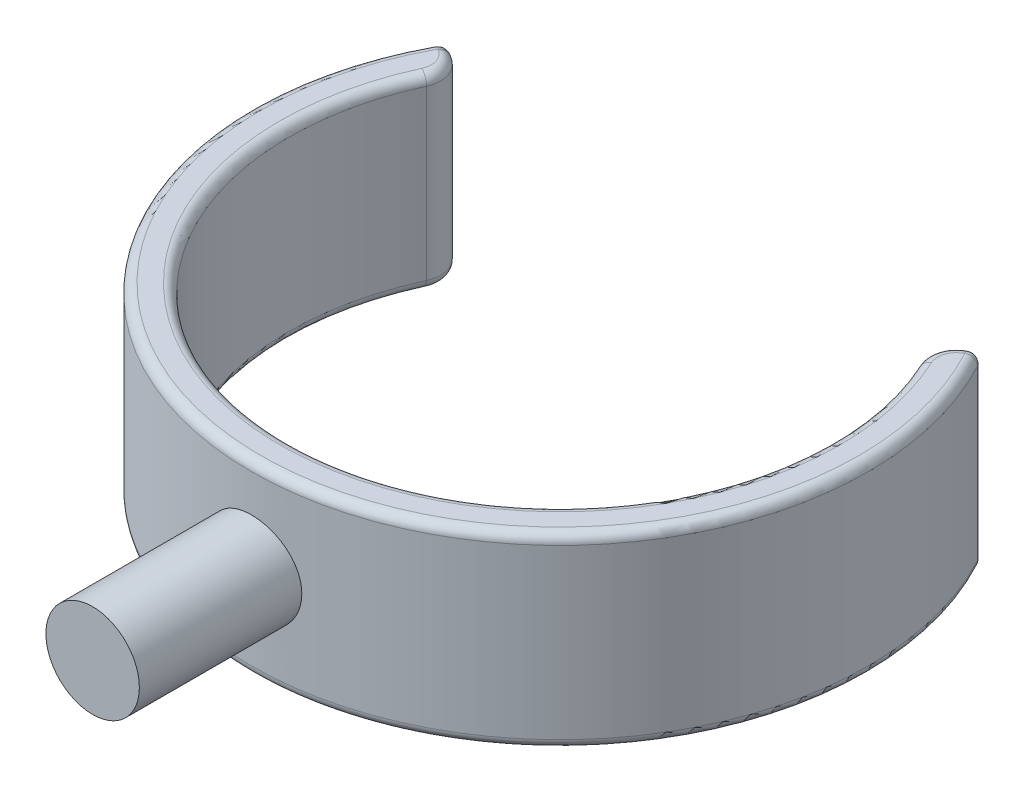
ISO-10303-21;
HEADER;
FILE_DESCRIPTION(('STEP AP214'),'2;1');
FILE_NAME('part.step','',(''),(''),'','','');
FILE_SCHEMA(('AUTOMOTIVE_DESIGN { 1 0 10303 214 1 1 1 1 }'));
ENDSEC;
DATA;
#1=APPLICATION_CONTEXT('core data for automotive mechanical design processes');
#2=APPLICATION_PROTOCOL_DEFINITION('international standard','automotive_design',2000,#1);
#3=PRODUCT_CONTEXT('',#1,'mechanical');
#4=PRODUCT('Part','Part','',(#3));
#5=PRODUCT_RELATED_PRODUCT_CATEGORY('part','',(#4));
#6=PRODUCT_DEFINITION_FORMATION('','',#4);
#7=PRODUCT_DEFINITION_CONTEXT('part definition',#1,'design');
#8=PRODUCT_DEFINITION('design','',#6,#7);
#9=PRODUCT_DEFINITION_SHAPE('','',#8);
#10=(LENGTH_UNIT() NAMED_UNIT(*) SI_UNIT(.MILLI.,.METRE.));
#11=(NAMED_UNIT(*) PLANE_ANGLE_UNIT() SI_UNIT($,.RADIAN.));
#12=(NAMED_UNIT(*) SI_UNIT($,.STERADIAN.) SOLID_ANGLE_UNIT());
#13=UNCERTAINTY_MEASURE_WITH_UNIT(LENGTH_MEASURE(1.E-05),#10,'distance_accuracy_value','');
#14=(GEOMETRIC_REPRESENTATION_CONTEXT(3) GLOBAL_UNCERTAINTY_ASSIGNED_CONTEXT((#13)) GLOBAL_UNIT_ASSIGNED_CONTEXT((#10,
#11,#12)) REPRESENTATION_CONTEXT('',''));
#15=CARTESIAN_POINT('',(0.,0.,0.));
#16=DIRECTION('',(0.,0.,1.));
#17=DIRECTION('',(1.,0.,0.));
#18=AXIS2_PLACEMENT_3D('',#15,#16,#17);
#19=CARTESIAN_POINT('',(0.,20.,0.));
#20=DIRECTION('',(0.,-1.,0.));
#21=DIRECTION('',(0.,0.,-1.));
#22=AXIS2_PLACEMENT_3D('',#19,#20,#21);
#23=CYLINDRICAL_SURFACE('',#22,29.);
#24=DIRECTION('',(0.,-1.,0.));
#25=VECTOR('',#24,1.);
#26=CARTESIAN_POINT('',(26.3635006361451,20.,-12.0816321003406));
#27=LINE('',#26,#25);
#28=CARTESIAN_POINT('',(26.3635006361451,19.,-12.0816321003406));
#29=VERTEX_POINT('',#28);
#30=CARTESIAN_POINT('',(26.3635006361451,1.,-12.0816321003406));
#31=VERTEX_POINT('',#30);
#32=EDGE_CURVE('E396',#29,#31,#27,.T.);
#33=ORIENTED_EDGE('',*,*,#32,.T.);
#34=CARTESIAN_POINT('',(0.,1.,0.));
#35=DIRECTION('',(0.,1.,0.));
#36=DIRECTION('',(0.,0.,1.));
#37=AXIS2_PLACEMENT_3D('',#34,#35,#36);
#38=CIRCLE('',#37,29.);
#39=CARTESIAN_POINT('',(-26.3635006361451,1.,-12.0816321003406));
#40=VERTEX_POINT('',#39);
#41=EDGE_CURVE('E210',#31,#40,#38,.F.);
#42=ORIENTED_EDGE('',*,*,#41,.T.);
#43=DIRECTION('',(0.,-1.,0.));
#44=VECTOR('',#43,1.);
#45=CARTESIAN_POINT('',(-26.3635006361451,20.,-12.0816321003406));
#46=LINE('',#45,#44);
#47=CARTESIAN_POINT('',(-26.3635006361451,19.,-12.0816321003406));
#48=VERTEX_POINT('',#47);
#49=EDGE_CURVE('E178',#40,#48,#46,.F.);
#50=ORIENTED_EDGE('',*,*,#49,.T.);
#51=CARTESIAN_POINT('',(0.,19.,0.));
#52=DIRECTION('',(0.,1.,0.));
#53=DIRECTION('',(0.,0.,1.));
#54=AXIS2_PLACEMENT_3D('',#51,#52,#53);
#55=CIRCLE('',#54,29.);
#56=EDGE_CURVE('E208',#48,#29,#55,.T.);
#57=ORIENTED_EDGE('',*,*,#56,.T.);
#58=EDGE_LOOP('',(#33,#42,#50,#57));
#59=FACE_BOUND('',#58,.T.);
#60=ADVANCED_FACE('F39',(#59),#23,.F.);
#61=CARTESIAN_POINT('',(-44.6611665210767,20.,-25.7851365132662));
#62=DIRECTION('',(-0.499999999999998,0.,0.86602540378444));
#63=DIRECTION('',(0.86602540378444,0.,0.499999999999998));
#64=AXIS2_PLACEMENT_3D('',#61,#62,#63);
#65=PLANE('',#64);
#66=DIRECTION('',(0.,1.,0.));
#67=VECTOR('',#66,1.);
#68=CARTESIAN_POINT('',(-27.5907593226428,0.,-15.9295323220739));
#69=LINE('',#68,#67);
#70=CARTESIAN_POINT('',(-27.5907593226428,19.,-15.9295323220739));
#71=VERTEX_POINT('',#70);
#72=CARTESIAN_POINT('',(-27.5907593226428,1.,-15.9295323220739));
#73=VERTEX_POINT('',#72);
#74=EDGE_CURVE('E283',#71,#73,#69,.F.);
#75=ORIENTED_EDGE('',*,*,#74,.T.);
#76=DIRECTION('',(-0.86602540378444,0.,-0.499999999999998));
#77=VECTOR('',#76,1.);
#78=CARTESIAN_POINT('',(-44.6611665210767,1.,-25.7851365132662));
#79=LINE('',#78,#77);
#80=CARTESIAN_POINT('',(-27.6992779689291,1.,-15.9921855917194));
#81=VERTEX_POINT('',#80);
#82=EDGE_CURVE('E220',#73,#81,#79,.T.);
#83=ORIENTED_EDGE('',*,*,#82,.T.);
#84=DIRECTION('',(0.,-1.,0.));
#85=VECTOR('',#84,1.);
#86=CARTESIAN_POINT('',(-27.6992779689291,20.,-15.9921855917194));
#87=LINE('',#86,#85);
#88=CARTESIAN_POINT('',(-27.6992779689291,19.,-15.9921855917194));
#89=VERTEX_POINT('',#88);
#90=EDGE_CURVE('E216',#81,#89,#87,.F.);
#91=ORIENTED_EDGE('',*,*,#90,.T.);
#92=DIRECTION('',(-0.86602540378444,0.,-0.499999999999998));
#93=VECTOR('',#92,1.);
#94=CARTESIAN_POINT('',(-27.5907593226428,19.,-15.9295323220739));
#95=LINE('',#94,#93);
#96=EDGE_CURVE('E218',#89,#71,#95,.F.);
#97=ORIENTED_EDGE('',*,*,#96,.T.);
#98=EDGE_LOOP('',(#75,#83,#91,#97));
#99=FACE_BOUND('',#98,.T.);
#100=ADVANCED_FACE('F309',(#99),#65,.F.);
#101=CARTESIAN_POINT('',(0.,20.,0.));
#102=DIRECTION('',(0.,-1.,0.));
#103=DIRECTION('',(0.,0.,-1.));
#104=AXIS2_PLACEMENT_3D('',#101,#102,#103);
#105=CYLINDRICAL_SURFACE('',#104,33.);
#106=CARTESIAN_POINT('',(0.,1.,0.));
#107=DIRECTION('',(0.,1.,0.));
#108=DIRECTION('',(0.,0.,1.));
#109=AXIS2_PLACEMENT_3D('',#106,#107,#108);
#110=CIRCLE('',#109,33.);
#111=CARTESIAN_POINT('',(-29.0805054054582,1.,-15.5988526938079));
#112=VERTEX_POINT('',#111);
#113=CARTESIAN_POINT('',(29.0805054054581,1.,-15.5988526938079));
#114=VERTEX_POINT('',#113);
#115=EDGE_CURVE('E151',#112,#114,#110,.T.);
#116=ORIENTED_EDGE('',*,*,#115,.T.);
#117=DIRECTION('',(0.,-1.,0.));
#118=VECTOR('',#117,1.);
#119=CARTESIAN_POINT('',(29.0805054054582,20.,-15.5988526938079));
#120=LINE('',#119,#118);
#121=CARTESIAN_POINT('',(29.0805054054581,19.,-15.5988526938079));
#122=VERTEX_POINT('',#121);
#123=EDGE_CURVE('E147',#114,#122,#120,.F.);
#124=ORIENTED_EDGE('',*,*,#123,.T.);
#125=CARTESIAN_POINT('',(0.,19.,0.));
#126=DIRECTION('',(0.,1.,0.));
#127=DIRECTION('',(0.,0.,1.));
#128=AXIS2_PLACEMENT_3D('',#125,#126,#127);
#129=CIRCLE('',#128,33.);
#130=CARTESIAN_POINT('',(-29.0805054054582,19.,-15.5988526938079));
#131=VERTEX_POINT('',#130);
#132=EDGE_CURVE('E138',#122,#131,#129,.F.);
#133=ORIENTED_EDGE('',*,*,#132,.T.);
#134=DIRECTION('',(0.,-1.,0.));
#135=VECTOR('',#134,1.);
#136=CARTESIAN_POINT('',(-29.0805054054582,20.,-15.5988526938079));
#137=LINE('',#136,#135);
#138=EDGE_CURVE('E144',#131,#112,#137,.T.);
#139=ORIENTED_EDGE('',*,*,#138,.T.);
#140=EDGE_LOOP('',(#116,#124,#133,#139));
#141=FACE_BOUND('',#140,.T.);
#142=CARTESIAN_POINT('',(5.,10.,32.6190128606002));
#143=CARTESIAN_POINT('',(5.00000192665984,10.1396069544715,32.6190120586395));
#144=CARTESIAN_POINT('',(4.99415103862507,10.2791870175158,32.6199108923944));
#145=CARTESIAN_POINT('',(4.97079452121915,10.5573893308295,32.6234785044994));
#146=CARTESIAN_POINT('',(4.95328645011318,10.6960113742827,32.6261476536626));
#147=CARTESIAN_POINT('',(4.90672869451265,10.971352221712,32.6331819578442));
#148=CARTESIAN_POINT('',(4.87767119254188,11.1080696715131,32.6375482615732));
#149=CARTESIAN_POINT('',(4.80822227699106,11.3785882661189,32.6478518497757));
#150=CARTESIAN_POINT('',(4.76782670544673,11.5123883216034,32.6537897105343));
#151=CARTESIAN_POINT('',(4.6760601350669,11.7759245236102,32.6670568956717));
#152=CARTESIAN_POINT('',(4.62470182705381,11.9056651719907,32.6743846100267));
#153=CARTESIAN_POINT('',(4.51133687014165,12.1603890487543,32.6902296466513));
#154=CARTESIAN_POINT('',(4.4493262975247,12.2853705033101,32.6987474070527));
#155=CARTESIAN_POINT('',(4.31514989882931,12.5296016677936,32.7167244403484));
#156=CARTESIAN_POINT('',(4.24298932085154,12.6488542973528,32.7261832259467));
#157=CARTESIAN_POINT('',(4.08896889507558,12.8809261947557,32.7457838461407));
#158=CARTESIAN_POINT('',(4.00710544681628,12.9937430513183,32.7559259336843));
#159=CARTESIAN_POINT('',(3.83366872007372,13.2128873867772,32.7766786291626));
#160=CARTESIAN_POINT('',(3.74203201297944,13.3191644096054,32.7872919995846));
#161=CARTESIAN_POINT('',(3.55012389447192,13.5236758065798,32.8086260305934));
#162=CARTESIAN_POINT('',(3.44984929992975,13.6219071896067,32.8193467294342));
#163=CARTESIAN_POINT('',(3.24141933049117,13.8095747701095,32.8405872042064));
#164=CARTESIAN_POINT('',(3.13326642166446,13.8990136993779,32.8511070417212));
#165=CARTESIAN_POINT('',(2.90975589484078,14.0685380754855,32.871658278091));
#166=CARTESIAN_POINT('',(2.79439563489949,14.1486200611801,32.8816894954098));
#167=CARTESIAN_POINT('',(2.55676158810282,14.2991676237201,32.9010218855155));
#168=CARTESIAN_POINT('',(2.43445873299751,14.3695877880992,32.9103195289356));
#169=CARTESIAN_POINT('',(2.18423564962776,14.499891464104,32.9278735067561));
#170=CARTESIAN_POINT('',(2.05631334860875,14.5597710463182,32.9361294524996));
#171=CARTESIAN_POINT('',(1.79583923759011,14.6684964219278,32.9513573753501));
#172=CARTESIAN_POINT('',(1.66328935855597,14.7173467554732,32.9583298805615));
#173=CARTESIAN_POINT('',(1.39445943305409,14.8036916518385,32.9708000422099));
#174=CARTESIAN_POINT('',(1.25817804086947,14.8411820574477,32.9762971586387));
#175=CARTESIAN_POINT('',(0.847406659384397,14.9356080690489,32.9902433027013));
#176=CARTESIAN_POINT('',(0.568683189634836,14.9754575281816,32.9962859892143));
#177=CARTESIAN_POINT('',(0.00859732671503502,15.0078659261048,33.0011893199961));
#178=CARTESIAN_POINT('',(-0.272764916017098,15.0004275446361,33.0000503712389));
#179=CARTESIAN_POINT('',(-0.827896167585145,14.9388154416578,32.9907713452382));
#180=CARTESIAN_POINT('',(-1.10170849404066,14.8850250084624,32.9826886876693));
#181=CARTESIAN_POINT('',(-1.63636428456872,14.732820772186,32.9604910769726));
#182=CARTESIAN_POINT('',(-1.89720740916023,14.6344058016975,32.9463759660322));
#183=CARTESIAN_POINT('',(-2.3996922958325,14.3953590931084,32.9136016709526));
#184=CARTESIAN_POINT('',(-2.64125625298012,14.2545662531324,32.8949251985631));
#185=CARTESIAN_POINT('',(-3.09747369937755,13.9348768619792,32.8551088590072));
#186=CARTESIAN_POINT('',(-3.31212538028877,13.7559777524737,32.8339688264887));
#187=CARTESIAN_POINT('',(-3.71068650832414,13.3630194277436,32.7913320784347));
#188=CARTESIAN_POINT('',(-3.89426589417274,13.1486254437099,32.7698339123106));
#189=CARTESIAN_POINT('',(-4.22289284177186,12.6918997086617,32.7291106144234));
#190=CARTESIAN_POINT('',(-4.36794015701221,12.4495677789273,32.7098854972027));
#191=CARTESIAN_POINT('',(-4.61543203328235,11.9434976803887,32.6758853113469));
#192=CARTESIAN_POINT('',(-4.7178421619618,11.6797424154348,32.6611138419721));
#193=CARTESIAN_POINT('',(-4.8768178438046,11.1385016080026,32.6377567418307));
#194=CARTESIAN_POINT('',(-4.93338669693512,10.8610170553781,32.6291706658023));
#195=CARTESIAN_POINT('',(-4.99862032680013,10.3031325036718,32.6192410869563));
#196=CARTESIAN_POINT('',(-5.00775321842609,10.0227884575548,32.6178268135524));
#197=CARTESIAN_POINT('',(-4.97909825587429,9.46457362877645,32.622213022562));
#198=CARTESIAN_POINT('',(-4.94131188822275,9.18670276803892,32.6280132764002));
#199=CARTESIAN_POINT('',(-4.82028824969943,8.64277547503194,32.6461099529893));
#200=CARTESIAN_POINT('',(-4.73728463596698,8.37666584533122,32.6583729693164));
#201=CARTESIAN_POINT('',(-4.52842583275397,7.86213627223473,32.6879858397363));
#202=CARTESIAN_POINT('',(-4.40256848757175,7.61371721950086,32.7053359497226));
#203=CARTESIAN_POINT('',(-4.11045213946573,7.13952336559406,32.7433346237613));
#204=CARTESIAN_POINT('',(-3.94389037779572,6.9139370540439,32.7640074885018));
#205=CARTESIAN_POINT('',(-3.57551268614489,6.49375094160133,32.8062493174229));
#206=CARTESIAN_POINT('',(-3.3736947208907,6.29915293084478,32.8278183332817));
#207=CARTESIAN_POINT('',(-2.93847462301882,5.94478339049824,32.8696437193355));
#208=CARTESIAN_POINT('',(-2.70481837643076,5.78532225713806,32.8898873599655));
#209=CARTESIAN_POINT('',(-2.21375181116489,5.50791787990848,32.926582215215));
#210=CARTESIAN_POINT('',(-1.95634215329136,5.38997348151004,32.9430335352898));
#211=CARTESIAN_POINT('',(-1.42609376273907,5.19944056177049,32.9702362076875));
#212=CARTESIAN_POINT('',(-1.1533167589458,5.12668297412297,32.981008783842));
#213=CARTESIAN_POINT('',(-0.599086140214578,5.02806009186323,32.9957226001482));
#214=CARTESIAN_POINT('',(-0.31763311177932,5.00219163456624,32.9996643010434));
#215=CARTESIAN_POINT('',(0.103109026834742,4.99911104617686,33.0001364906781));
#216=CARTESIAN_POINT('',(0.24248874350503,5.00393654534392,32.9994025865838));
#217=CARTESIAN_POINT('',(0.52032521716914,5.02520015761581,32.9961890458264));
#218=CARTESIAN_POINT('',(0.658782300075636,5.04163392378332,32.9937100626427));
#219=CARTESIAN_POINT('',(0.933840583513198,5.08600301759584,32.9870716269616));
#220=CARTESIAN_POINT('',(1.07044110056105,5.1139424685222,32.9829115720302));
#221=CARTESIAN_POINT('',(1.34073318946921,5.1810980494345,32.9730300750181));
#222=CARTESIAN_POINT('',(1.47442579460891,5.22031010107097,32.9673091976703));
#223=CARTESIAN_POINT('',(1.7379584276119,5.30970639255298,32.9544670800425));
#224=CARTESIAN_POINT('',(1.86780001912467,5.35988610790275,32.9473464173382));
#225=CARTESIAN_POINT('',(2.12274342624012,5.47084112850089,32.9319034494591));
#226=CARTESIAN_POINT('',(2.24784692973733,5.53161261648858,32.9235815773836));
#227=CARTESIAN_POINT('',(2.4925526956901,5.66335408463935,32.9059605099242));
#228=CARTESIAN_POINT('',(2.61215283918865,5.73432795035689,32.8966609425512));
#229=CARTESIAN_POINT('',(2.84494606015405,5.88593031108237,32.877346625813));
#230=CARTESIAN_POINT('',(2.95814139107547,5.96655537893393,32.8673321308266));
#231=CARTESIAN_POINT('',(3.17849380078643,6.13776793000525,32.8467585176627));
#232=CARTESIAN_POINT('',(3.28557991134737,6.22844623530199,32.8361949852536));
#233=CARTESIAN_POINT('',(3.49170974373309,6.41843572311377,32.814915781674));
#234=CARTESIAN_POINT('',(3.59075634129775,6.51774379220179,32.8042001665293));
#235=CARTESIAN_POINT('',(3.78022400154449,6.72439790858376,32.782907170168));
#236=CARTESIAN_POINT('',(3.8706398439949,6.83174875129379,32.7723298759093));
#237=CARTESIAN_POINT('',(4.04211672263787,7.05365530786531,32.7516221074501));
#238=CARTESIAN_POINT('',(4.12318119901679,7.16820834806223,32.741491469786));
#239=CARTESIAN_POINT('',(4.27588960457509,7.40448934176986,32.7218999019805));
#240=CARTESIAN_POINT('',(4.34747273408464,7.52625697603383,32.7124434582483));
#241=CARTESIAN_POINT('',(4.48008549783052,7.7754225087075,32.6945455846914));
#242=CARTESIAN_POINT('',(4.54111901127469,7.90281831584868,32.6861037821215));
#243=CARTESIAN_POINT('',(4.65217405521694,8.16229126517769,32.6704824398423));
#244=CARTESIAN_POINT('',(4.70220362797238,8.29436490604269,32.6633019790562));
#245=CARTESIAN_POINT('',(4.79091971766363,8.5622914694291,32.6504072185448));
#246=CARTESIAN_POINT('',(4.82960876832422,8.69814354032737,32.6446925913553));
#247=CARTESIAN_POINT('',(4.90808713602941,9.02584127356953,32.6330024269535));
#248=CARTESIAN_POINT('',(4.94251568260748,9.21902339395641,32.6277806593036));
#249=CARTESIAN_POINT('',(4.98847060972303,9.60815468367378,32.6207864618445));
#250=CARTESIAN_POINT('',(4.99999729651499,9.80410381596719,32.6190139859097));
#251=CARTESIAN_POINT('',(5.,10.,32.6190128606002));
#252=B_SPLINE_CURVE_WITH_KNOTS('',3,(#142,#143,#144,#145,#146,#147,#148,#149,#150,#151,#152,
#153,#154,#155,#156,#157,#158,#159,#160,#161,#162,#163,#164,#165,#166,#167,#168,#169,#170,#171,
#172,#173,#174,#175,#176,#177,#178,#179,#180,#181,#182,#183,#184,#185,#186,#187,#188,#189,#190,
#191,#192,#193,#194,#195,#196,#197,#198,#199,#200,#201,#202,#203,#204,#205,#206,#207,#208,#209,
#210,#211,#212,#213,#214,#215,#216,#217,#218,#219,#220,#221,#222,#223,#224,#225,#226,#227,#228,
#229,#230,#231,#232,#233,#234,#235,#236,#237,#238,#239,#240,#241,#242,#243,#244,#245,#246,#247,
#248,#249,#250,#251),.UNSPECIFIED.,.T.,.F.,(4,2,2,2,2,2,2,2,2,2,2,2,2,2,2,2,2,2,2,2,2,2,2,2,2,2,
2,2,2,2,2,2,2,2,2,2,2,2,2,2,2,2,2,2,2,2,2,2,2,2,2,2,2,2,4),(0.,0.418649207232514,
0.837386133089757,1.25640697387144,1.67558168169612,2.09427374562179,2.51312036504731,
2.93175120885312,3.35053788396391,3.7722302170377,4.19407861729732,4.61579553335324,
5.03766795243722,5.46145988730577,5.88540947403992,6.30918422398661,6.7331138692107,
7.57356481536739,8.41396813468006,9.24748806760021,10.0810298072125,10.9177812067864,
11.7545888007832,12.5997925001271,13.4450016065587,14.2908919574986,15.1367214100803,
15.9741878386159,16.8116277346772,17.6447807063818,18.4779755949648,19.3175671977147,
20.1572072845118,21.0039911688366,21.8507515032885,22.6943242931683,23.5378401817129,
23.9558285050783,24.3736603876523,24.7916421387295,25.2094728567879,25.6271315311747,
26.0446399920215,26.4623078834612,26.8798278979403,27.3014861634888,27.7229929307137,
28.1447530480638,28.5663575098686,28.9905466322611,29.4145794423646,29.8383013096061,
30.2619284356764,30.8493839759683,31.4368316604743),.UNSPECIFIED.);
#253=CARTESIAN_POINT('',(5.,10.,32.6190128606002));
#254=VERTEX_POINT('',#253);
#255=EDGE_CURVE('E278',#254,#254,#252,.T.);
#256=ORIENTED_EDGE('',*,*,#255,.F.);
#257=EDGE_LOOP('',(#256));
#258=FACE_BOUND('',#257,.T.);
#259=ADVANCED_FACE('F141',(#141,#258),#105,.T.);
#260=CARTESIAN_POINT('',(-51.8058761022983,20.,29.9101365132662));
#261=DIRECTION('',(-0.499999999999998,0.,-0.86602540378444));
#262=DIRECTION('',(-0.86602540378444,0.,0.499999999999998));
#263=AXIS2_PLACEMENT_3D('',#260,#261,#262);
#264=PLANE('',#263);
#265=DIRECTION('',(0.,1.,0.));
#266=VECTOR('',#265,1.);
#267=CARTESIAN_POINT('',(27.6992779689291,0.,-15.9921855917194));
#268=LINE('',#267,#266);
#269=CARTESIAN_POINT('',(27.6992779689291,19.,-15.9921855917194));
#270=VERTEX_POINT('',#269);
#271=CARTESIAN_POINT('',(27.6992779689291,1.,-15.9921855917194));
#272=VERTEX_POINT('',#271);
#273=EDGE_CURVE('E197',#270,#272,#268,.F.);
#274=ORIENTED_EDGE('',*,*,#273,.T.);
#275=DIRECTION('',(0.86602540378444,0.,-0.499999999999998));
#276=VECTOR('',#275,1.);
#277=CARTESIAN_POINT('',(27.5907593226428,1.,-15.9295323220739));
#278=LINE('',#277,#276);
#279=CARTESIAN_POINT('',(27.5907593226428,1.,-15.9295323220739));
#280=VERTEX_POINT('',#279);
#281=EDGE_CURVE('E201',#272,#280,#278,.F.);
#282=ORIENTED_EDGE('',*,*,#281,.T.);
#283=DIRECTION('',(0.,-1.,0.));
#284=VECTOR('',#283,1.);
#285=CARTESIAN_POINT('',(27.5907593226428,20.,-15.9295323220739));
#286=LINE('',#285,#284);
#287=CARTESIAN_POINT('',(27.5907593226428,19.,-15.9295323220739));
#288=VERTEX_POINT('',#287);
#289=EDGE_CURVE('E175',#280,#288,#286,.F.);
#290=ORIENTED_EDGE('',*,*,#289,.T.);
#291=DIRECTION('',(0.86602540378444,0.,-0.499999999999998));
#292=VECTOR('',#291,1.);
#293=CARTESIAN_POINT('',(-51.8058761022983,19.,29.9101365132662));
#294=LINE('',#293,#292);
#295=EDGE_CURVE('E199',#288,#270,#294,.T.);
#296=ORIENTED_EDGE('',*,*,#295,.T.);
#297=EDGE_LOOP('',(#274,#282,#290,#296));
#298=FACE_BOUND('',#297,.T.);
#299=ADVANCED_FACE('F398',(#298),#264,.T.);
#300=CARTESIAN_POINT('',(-64.3113617489165,20.,8.25000000000004));
#301=DIRECTION('',(0.,1.,0.));
#302=DIRECTION('',(0.,0.,1.));
#303=AXIS2_PLACEMENT_3D('',#300,#301,#302);
#304=PLANE('',#303);
#305=DIRECTION('',(0.86602540378444,0.,-0.499999999999998));
#306=VECTOR('',#305,1.);
#307=CARTESIAN_POINT('',(-51.3058761022983,20.,30.7761619170506));
#308=LINE('',#307,#306);
#309=CARTESIAN_POINT('',(28.1992779689291,20.,-15.126160187935));
#310=VERTEX_POINT('',#309);
#311=CARTESIAN_POINT('',(28.0907593226428,20.,-15.0635069182895));
#312=VERTEX_POINT('',#311);
#313=EDGE_CURVE('E48',#310,#312,#308,.F.);
#314=ORIENTED_EDGE('',*,*,#313,.T.);
#315=CARTESIAN_POINT('',(29.0907593226428,20.,-13.3314561107206));
#316=DIRECTION('',(0.,1.,0.));
#317=DIRECTION('',(0.,0.,1.));
#318=AXIS2_PLACEMENT_3D('',#315,#316,#317);
#319=CIRCLE('',#318,2.);
#320=CARTESIAN_POINT('',(27.2725868649776,20.,-12.4982401038006));
#321=VERTEX_POINT('',#320);
#322=EDGE_CURVE('E11',#312,#321,#319,.T.);
#323=ORIENTED_EDGE('',*,*,#322,.T.);
#324=CARTESIAN_POINT('',(0.,20.,0.));
#325=DIRECTION('',(0.,1.,0.));
#326=DIRECTION('',(0.,0.,1.));
#327=AXIS2_PLACEMENT_3D('',#324,#325,#326);
#328=CIRCLE('',#327,30.);
#329=CARTESIAN_POINT('',(-27.2725868649776,20.,-12.4982401038006));
#330=VERTEX_POINT('',#329);
#331=EDGE_CURVE('E222',#321,#330,#328,.F.);
#332=ORIENTED_EDGE('',*,*,#331,.T.);
#333=CARTESIAN_POINT('',(-29.0907593226428,20.,-13.3314561107206));
#334=DIRECTION('',(0.,1.,0.));
#335=DIRECTION('',(0.,0.,1.));
#336=AXIS2_PLACEMENT_3D('',#333,#334,#335);
#337=CIRCLE('',#336,2.);
#338=CARTESIAN_POINT('',(-28.0907593226428,20.,-15.0635069182895));
#339=VERTEX_POINT('',#338);
#340=EDGE_CURVE('E224',#330,#339,#337,.T.);
#341=ORIENTED_EDGE('',*,*,#340,.T.);
#342=DIRECTION('',(-0.86602540378444,0.,-0.499999999999998));
#343=VECTOR('',#342,1.);
#344=CARTESIAN_POINT('',(-29.0788383248865,20.,-15.6339745962155));
#345=LINE('',#344,#343);
#346=CARTESIAN_POINT('',(-28.1992779689291,20.,-15.126160187935));
#347=VERTEX_POINT('',#346);
#348=EDGE_CURVE('E226',#339,#347,#345,.T.);
#349=ORIENTED_EDGE('',*,*,#348,.T.);
#350=CARTESIAN_POINT('',(0.,20.,0.));
#351=DIRECTION('',(0.,1.,0.));
#352=DIRECTION('',(0.,0.,1.));
#353=AXIS2_PLACEMENT_3D('',#350,#351,#352);
#354=CIRCLE('',#353,32.);
#355=EDGE_CURVE('E59',#347,#310,#354,.T.);
#356=ORIENTED_EDGE('',*,*,#355,.T.);
#357=EDGE_LOOP('',(#314,#323,#332,#341,#349,#356));
#358=FACE_BOUND('',#357,.T.);
#359=ADVANCED_FACE('F305',(#358),#304,.T.);
#360=CARTESIAN_POINT('',(-64.3113617489165,0.,8.25000000000004));
#361=DIRECTION('',(0.,1.,0.));
#362=DIRECTION('',(0.,0.,1.));
#363=AXIS2_PLACEMENT_3D('',#360,#361,#362);
#364=PLANE('',#363);
#365=DIRECTION('',(0.86602540378444,0.,-0.499999999999998));
#366=VECTOR('',#365,1.);
#367=CARTESIAN_POINT('',(29.0788383248865,0.,-15.6339745962155));
#368=LINE('',#367,#366);
#369=CARTESIAN_POINT('',(28.0907593226428,0.,-15.0635069182895));
#370=VERTEX_POINT('',#369);
#371=CARTESIAN_POINT('',(28.1992779689291,0.,-15.126160187935));
#372=VERTEX_POINT('',#371);
#373=EDGE_CURVE('E192',#370,#372,#368,.T.);
#374=ORIENTED_EDGE('',*,*,#373,.T.);
#375=CARTESIAN_POINT('',(0.,0.,0.));
#376=DIRECTION('',(0.,1.,0.));
#377=DIRECTION('',(0.,0.,1.));
#378=AXIS2_PLACEMENT_3D('',#375,#376,#377);
#379=CIRCLE('',#378,32.);
#380=CARTESIAN_POINT('',(-28.1992779689291,0.,-15.126160187935));
#381=VERTEX_POINT('',#380);
#382=EDGE_CURVE('E194',#372,#381,#379,.F.);
#383=ORIENTED_EDGE('',*,*,#382,.T.);
#384=DIRECTION('',(-0.86602540378444,0.,-0.499999999999998));
#385=VECTOR('',#384,1.);
#386=CARTESIAN_POINT('',(-45.1611665210767,0.,-24.9191111094817));
#387=LINE('',#386,#385);
#388=CARTESIAN_POINT('',(-28.0907593226428,0.,-15.0635069182895));
#389=VERTEX_POINT('',#388);
#390=EDGE_CURVE('E184',#381,#389,#387,.F.);
#391=ORIENTED_EDGE('',*,*,#390,.T.);
#392=CARTESIAN_POINT('',(-29.0907593226428,0.,-13.3314561107206));
#393=DIRECTION('',(0.,1.,0.));
#394=DIRECTION('',(0.,0.,1.));
#395=AXIS2_PLACEMENT_3D('',#392,#393,#394);
#396=CIRCLE('',#395,2.);
#397=CARTESIAN_POINT('',(-27.2725868649776,0.,-12.4982401038006));
#398=VERTEX_POINT('',#397);
#399=EDGE_CURVE('E186',#389,#398,#396,.F.);
#400=ORIENTED_EDGE('',*,*,#399,.T.);
#401=CARTESIAN_POINT('',(0.,0.,0.));
#402=DIRECTION('',(0.,1.,0.));
#403=DIRECTION('',(0.,0.,1.));
#404=AXIS2_PLACEMENT_3D('',#401,#402,#403);
#405=CIRCLE('',#404,30.);
#406=CARTESIAN_POINT('',(27.2725868649776,0.,-12.4982401038006));
#407=VERTEX_POINT('',#406);
#408=EDGE_CURVE('E188',#398,#407,#405,.T.);
#409=ORIENTED_EDGE('',*,*,#408,.T.);
#410=CARTESIAN_POINT('',(29.0907593226428,0.,-13.3314561107206));
#411=DIRECTION('',(0.,1.,0.));
#412=DIRECTION('',(0.,0.,1.));
#413=AXIS2_PLACEMENT_3D('',#410,#411,#412);
#414=CIRCLE('',#413,2.);
#415=EDGE_CURVE('E190',#407,#370,#414,.F.);
#416=ORIENTED_EDGE('',*,*,#415,.T.);
#417=EDGE_LOOP('',(#374,#383,#391,#400,#409,#416));
#418=FACE_BOUND('',#417,.T.);
#419=ADVANCED_FACE('F298',(#418),#364,.F.);
#420=CARTESIAN_POINT('',(0.,10.,50.));
#421=DIRECTION('',(0.,0.,1.));
#422=DIRECTION('',(1.,0.,0.));
#423=AXIS2_PLACEMENT_3D('',#420,#421,#422);
#424=PLANE('',#423);
#425=CARTESIAN_POINT('',(0.,10.,50.));
#426=DIRECTION('',(0.,0.,1.));
#427=DIRECTION('',(1.,0.,0.));
#428=AXIS2_PLACEMENT_3D('',#425,#426,#427);
#429=CIRCLE('',#428,5.);
#430=CARTESIAN_POINT('',(5.,10.,50.));
#431=VERTEX_POINT('',#430);
#432=EDGE_CURVE('E272',#431,#431,#429,.T.);
#433=ORIENTED_EDGE('',*,*,#432,.T.);
#434=EDGE_LOOP('',(#433));
#435=FACE_BOUND('',#434,.T.);
#436=ADVANCED_FACE('F296',(#435),#424,.T.);
#437=CARTESIAN_POINT('',(0.,10.,-16.5009999999999));
#438=DIRECTION('',(0.,0.,1.));
#439=DIRECTION('',(1.,0.,0.));
#440=AXIS2_PLACEMENT_3D('',#437,#438,#439);
#441=CYLINDRICAL_SURFACE('',#440,5.);
#442=ORIENTED_EDGE('',*,*,#432,.F.);
#443=EDGE_LOOP('',(#442));
#444=FACE_BOUND('',#443,.T.);
#445=ORIENTED_EDGE('',*,*,#255,.T.);
#446=EDGE_LOOP('',(#445));
#447=FACE_BOUND('',#446,.T.);
#448=ADVANCED_FACE('F291',(#444,#447),#441,.T.);
#449=CARTESIAN_POINT('',(-29.0907593226428,20.,-13.3314561107206));
#450=DIRECTION('',(0.,-1.,0.));
#451=DIRECTION('',(0.,0.,-1.));
#452=AXIS2_PLACEMENT_3D('',#449,#450,#451);
#453=CYLINDRICAL_SURFACE('',#452,3.);
#454=ORIENTED_EDGE('',*,*,#49,.F.);
#455=CARTESIAN_POINT('',(-29.0907593226428,1.,-13.3314561107206));
#456=DIRECTION('',(0.,1.,0.));
#457=DIRECTION('',(0.,0.,1.));
#458=AXIS2_PLACEMENT_3D('',#455,#456,#457);
#459=CIRCLE('',#458,3.);
#460=EDGE_CURVE('E214',#40,#73,#459,.T.);
#461=ORIENTED_EDGE('',*,*,#460,.T.);
#462=ORIENTED_EDGE('',*,*,#74,.F.);
#463=CARTESIAN_POINT('',(-29.0907593226428,19.,-13.3314561107206));
#464=DIRECTION('',(0.,1.,0.));
#465=DIRECTION('',(0.,0.,1.));
#466=AXIS2_PLACEMENT_3D('',#463,#464,#465);
#467=CIRCLE('',#466,3.);
#468=EDGE_CURVE('E212',#71,#48,#467,.F.);
#469=ORIENTED_EDGE('',*,*,#468,.T.);
#470=EDGE_LOOP('',(#454,#461,#462,#469));
#471=FACE_BOUND('',#470,.T.);
#472=ADVANCED_FACE('F303',(#471),#453,.T.);
#473=CARTESIAN_POINT('',(29.0907593226428,20.,-13.3314561107206));
#474=DIRECTION('',(0.,-1.,0.));
#475=DIRECTION('',(0.,0.,-1.));
#476=AXIS2_PLACEMENT_3D('',#473,#474,#475);
#477=CYLINDRICAL_SURFACE('',#476,3.);
#478=ORIENTED_EDGE('',*,*,#289,.F.);
#479=CARTESIAN_POINT('',(29.0907593226428,1.,-13.3314561107206));
#480=DIRECTION('',(0.,1.,0.));
#481=DIRECTION('',(0.,0.,1.));
#482=AXIS2_PLACEMENT_3D('',#479,#480,#481);
#483=CIRCLE('',#482,3.);
#484=EDGE_CURVE('E206',#280,#31,#483,.T.);
#485=ORIENTED_EDGE('',*,*,#484,.T.);
#486=ORIENTED_EDGE('',*,*,#32,.F.);
#487=CARTESIAN_POINT('',(29.0907593226428,19.,-13.3314561107206));
#488=DIRECTION('',(0.,1.,0.));
#489=DIRECTION('',(0.,0.,1.));
#490=AXIS2_PLACEMENT_3D('',#487,#488,#489);
#491=CIRCLE('',#490,3.);
#492=EDGE_CURVE('E204',#29,#288,#491,.F.);
#493=ORIENTED_EDGE('',*,*,#492,.T.);
#494=EDGE_LOOP('',(#478,#485,#486,#493));
#495=FACE_BOUND('',#494,.T.);
#496=ADVANCED_FACE('F322',(#495),#477,.T.);
#497=CARTESIAN_POINT('',(0.,19.,0.));
#498=DIRECTION('',(0.,1.,0.));
#499=DIRECTION('',(0.,0.,1.));
#500=AXIS2_PLACEMENT_3D('',#497,#498,#499);
#501=TOROIDAL_SURFACE('',#500,30.,1.);
#502=CARTESIAN_POINT('',(27.2725868649776,19.,-12.4982401038006));
#503=DIRECTION('',(-0.416608003460019,0.,-0.909086228832588));
#504=DIRECTION('',(-0.909086228832588,0.,0.416608003460019));
#505=AXIS2_PLACEMENT_3D('',#502,#503,#504);
#506=CIRCLE('',#505,1.);
#507=EDGE_CURVE('E266',#29,#321,#506,.T.);
#508=ORIENTED_EDGE('',*,*,#507,.F.);
#509=ORIENTED_EDGE('',*,*,#56,.F.);
#510=CARTESIAN_POINT('',(-27.2725868649776,19.,-12.4982401038006));
#511=DIRECTION('',(0.416608003460019,0.,-0.909086228832588));
#512=DIRECTION('',(-0.909086228832588,0.,-0.416608003460019));
#513=AXIS2_PLACEMENT_3D('',#510,#511,#512);
#514=CIRCLE('',#513,1.);
#515=EDGE_CURVE('E43',#330,#48,#514,.T.);
#516=ORIENTED_EDGE('',*,*,#515,.F.);
#517=ORIENTED_EDGE('',*,*,#331,.F.);
#518=EDGE_LOOP('',(#508,#509,#516,#517));
#519=FACE_BOUND('',#518,.T.);
#520=ADVANCED_FACE('F41',(#519),#501,.T.);
#521=CARTESIAN_POINT('',(-29.0907593226428,19.,-13.3314561107206));
#522=DIRECTION('',(0.,1.,0.));
#523=DIRECTION('',(0.,0.,1.));
#524=AXIS2_PLACEMENT_3D('',#521,#522,#523);
#525=TOROIDAL_SURFACE('',#524,2.,1.);
#526=ORIENTED_EDGE('',*,*,#515,.T.);
#527=ORIENTED_EDGE('',*,*,#468,.F.);
#528=CARTESIAN_POINT('',(-28.0907593226428,19.,-15.0635069182895));
#529=DIRECTION('',(-0.866025403784438,0.,-0.500000000000001));
#530=DIRECTION('',(-0.500000000000001,0.,0.866025403784438));
#531=AXIS2_PLACEMENT_3D('',#528,#529,#530);
#532=CIRCLE('',#531,1.);
#533=EDGE_CURVE('E264',#339,#71,#532,.T.);
#534=ORIENTED_EDGE('',*,*,#533,.F.);
#535=ORIENTED_EDGE('',*,*,#340,.F.);
#536=EDGE_LOOP('',(#526,#527,#534,#535));
#537=FACE_BOUND('',#536,.T.);
#538=ADVANCED_FACE('F383',(#537),#525,.T.);
#539=CARTESIAN_POINT('',(29.0907593226428,19.,-13.3314561107206));
#540=DIRECTION('',(0.,1.,0.));
#541=DIRECTION('',(0.,0.,1.));
#542=AXIS2_PLACEMENT_3D('',#539,#540,#541);
#543=TOROIDAL_SURFACE('',#542,2.,1.);
#544=ORIENTED_EDGE('',*,*,#507,.T.);
#545=ORIENTED_EDGE('',*,*,#322,.F.);
#546=CARTESIAN_POINT('',(28.0907593226428,19.,-15.0635069182895));
#547=DIRECTION('',(0.866025403784442,0.,-0.499999999999994));
#548=DIRECTION('',(-0.499999999999994,0.,-0.866025403784442));
#549=AXIS2_PLACEMENT_3D('',#546,#547,#548);
#550=CIRCLE('',#549,1.);
#551=EDGE_CURVE('E261',#288,#312,#550,.T.);
#552=ORIENTED_EDGE('',*,*,#551,.F.);
#553=ORIENTED_EDGE('',*,*,#492,.F.);
#554=EDGE_LOOP('',(#544,#545,#552,#553));
#555=FACE_BOUND('',#554,.T.);
#556=ADVANCED_FACE('F380',(#555),#543,.T.);
#557=CARTESIAN_POINT('',(-45.1611665210767,19.,-24.9191111094817));
#558=DIRECTION('',(0.86602540378444,0.,0.499999999999998));
#559=DIRECTION('',(0.499999999999998,0.,-0.86602540378444));
#560=AXIS2_PLACEMENT_3D('',#557,#558,#559);
#561=CYLINDRICAL_SURFACE('',#560,1.);
#562=ORIENTED_EDGE('',*,*,#533,.T.);
#563=ORIENTED_EDGE('',*,*,#96,.F.);
#564=CARTESIAN_POINT('',(-28.1992779689291,19.,-15.126160187935));
#565=DIRECTION('',(-0.86602540378444,0.,-0.499999999999998));
#566=DIRECTION('',(-0.499999999999998,0.,0.86602540378444));
#567=AXIS2_PLACEMENT_3D('',#564,#565,#566);
#568=CIRCLE('',#567,1.);
#569=EDGE_CURVE('E160',#347,#89,#568,.T.);
#570=ORIENTED_EDGE('',*,*,#569,.F.);
#571=ORIENTED_EDGE('',*,*,#348,.F.);
#572=EDGE_LOOP('',(#562,#563,#570,#571));
#573=FACE_BOUND('',#572,.T.);
#574=ADVANCED_FACE('F377',(#573),#561,.T.);
#575=CARTESIAN_POINT('',(0.,19.,0.));
#576=DIRECTION('',(0.,1.,0.));
#577=DIRECTION('',(0.,0.,1.));
#578=AXIS2_PLACEMENT_3D('',#575,#576,#577);
#579=TOROIDAL_SURFACE('',#578,32.,1.);
#580=CARTESIAN_POINT('',(28.1992779689291,19.,-15.126160187935));
#581=DIRECTION('',(-0.472692505872965,0.,-0.881227436529036));
#582=DIRECTION('',(-0.881227436529036,0.,0.472692505872965));
#583=AXIS2_PLACEMENT_3D('',#580,#581,#582);
#584=CIRCLE('',#583,1.);
#585=EDGE_CURVE('E161',#310,#122,#584,.T.);
#586=ORIENTED_EDGE('',*,*,#585,.F.);
#587=ORIENTED_EDGE('',*,*,#355,.F.);
#588=CARTESIAN_POINT('',(-28.1992779689291,19.,-15.126160187935));
#589=DIRECTION('',(0.472692505872968,0.,-0.881227436529035));
#590=DIRECTION('',(-0.881227436529035,0.,-0.472692505872968));
#591=AXIS2_PLACEMENT_3D('',#588,#589,#590);
#592=CIRCLE('',#591,1.);
#593=EDGE_CURVE('E154',#131,#347,#592,.T.);
#594=ORIENTED_EDGE('',*,*,#593,.F.);
#595=ORIENTED_EDGE('',*,*,#132,.F.);
#596=EDGE_LOOP('',(#586,#587,#594,#595));
#597=FACE_BOUND('',#596,.T.);
#598=ADVANCED_FACE('F156',(#597),#579,.T.);
#599=CARTESIAN_POINT('',(-51.3058761022983,19.,30.7761619170506));
#600=DIRECTION('',(0.86602540378444,0.,-0.499999999999998));
#601=DIRECTION('',(-0.499999999999998,0.,-0.86602540378444));
#602=AXIS2_PLACEMENT_3D('',#599,#600,#601);
#603=CYLINDRICAL_SURFACE('',#602,1.);
#604=ORIENTED_EDGE('',*,*,#551,.T.);
#605=ORIENTED_EDGE('',*,*,#313,.F.);
#606=CARTESIAN_POINT('',(28.1992779689291,19.,-15.126160187935));
#607=DIRECTION('',(0.86602540378444,0.,-0.499999999999997));
#608=DIRECTION('',(-0.499999999999998,0.,-0.86602540378444));
#609=AXIS2_PLACEMENT_3D('',#606,#607,#608);
#610=CIRCLE('',#609,1.);
#611=EDGE_CURVE('E253',#270,#310,#610,.T.);
#612=ORIENTED_EDGE('',*,*,#611,.F.);
#613=ORIENTED_EDGE('',*,*,#295,.F.);
#614=EDGE_LOOP('',(#604,#605,#612,#613));
#615=FACE_BOUND('',#614,.T.);
#616=ADVANCED_FACE('F370',(#615),#603,.T.);
#617=CARTESIAN_POINT('',(0.,1.,0.));
#618=DIRECTION('',(0.,1.,0.));
#619=DIRECTION('',(0.,0.,1.));
#620=AXIS2_PLACEMENT_3D('',#617,#618,#619);
#621=TOROIDAL_SURFACE('',#620,30.,1.);
#622=CARTESIAN_POINT('',(27.2725868649776,1.,-12.4982401038006));
#623=DIRECTION('',(-0.416608003460019,0.,-0.909086228832588));
#624=DIRECTION('',(-0.909086228832588,0.,0.416608003460019));
#625=AXIS2_PLACEMENT_3D('',#622,#623,#624);
#626=CIRCLE('',#625,1.);
#627=EDGE_CURVE('E250',#407,#31,#626,.T.);
#628=ORIENTED_EDGE('',*,*,#627,.F.);
#629=ORIENTED_EDGE('',*,*,#408,.F.);
#630=CARTESIAN_POINT('',(-27.2725868649776,1.,-12.4982401038006));
#631=DIRECTION('',(0.416608003460019,0.,-0.909086228832588));
#632=DIRECTION('',(-0.909086228832588,0.,-0.416608003460019));
#633=AXIS2_PLACEMENT_3D('',#630,#631,#632);
#634=CIRCLE('',#633,1.);
#635=EDGE_CURVE('E258',#40,#398,#634,.T.);
#636=ORIENTED_EDGE('',*,*,#635,.F.);
#637=ORIENTED_EDGE('',*,*,#41,.F.);
#638=EDGE_LOOP('',(#628,#629,#636,#637));
#639=FACE_BOUND('',#638,.T.);
#640=ADVANCED_FACE('F366',(#639),#621,.T.);
#641=CARTESIAN_POINT('',(-29.0907593226428,1.,-13.3314561107206));
#642=DIRECTION('',(0.,1.,0.));
#643=DIRECTION('',(0.,0.,1.));
#644=AXIS2_PLACEMENT_3D('',#641,#642,#643);
#645=TOROIDAL_SURFACE('',#644,2.,1.);
#646=ORIENTED_EDGE('',*,*,#635,.T.);
#647=ORIENTED_EDGE('',*,*,#399,.F.);
#648=CARTESIAN_POINT('',(-28.0907593226428,1.,-15.0635069182895));
#649=DIRECTION('',(-0.86602540378444,0.,-0.499999999999997));
#650=DIRECTION('',(-0.499999999999998,0.,0.86602540378444));
#651=AXIS2_PLACEMENT_3D('',#648,#649,#650);
#652=CIRCLE('',#651,1.);
#653=EDGE_CURVE('E168',#73,#389,#652,.T.);
#654=ORIENTED_EDGE('',*,*,#653,.F.);
#655=ORIENTED_EDGE('',*,*,#460,.F.);
#656=EDGE_LOOP('',(#646,#647,#654,#655));
#657=FACE_BOUND('',#656,.T.);
#658=ADVANCED_FACE('F363',(#657),#645,.T.);
#659=CARTESIAN_POINT('',(-28.1992779689291,19.,-15.126160187935));
#660=DIRECTION('',(0.,0.,1.));
#661=DIRECTION('',(1.,0.,0.));
#662=AXIS2_PLACEMENT_3D('',#659,#660,#661);
#663=SPHERICAL_SURFACE('',#662,1.);
#664=ORIENTED_EDGE('',*,*,#593,.T.);
#665=ORIENTED_EDGE('',*,*,#569,.T.);
#666=CARTESIAN_POINT('',(-28.1992779689291,19.,-15.126160187935));
#667=DIRECTION('',(0.,1.,0.));
#668=DIRECTION('',(0.,0.,1.));
#669=AXIS2_PLACEMENT_3D('',#666,#667,#668);
#670=CIRCLE('',#669,1.);
#671=EDGE_CURVE('E164',#131,#89,#670,.F.);
#672=ORIENTED_EDGE('',*,*,#671,.F.);
#673=EDGE_LOOP('',(#664,#665,#672));
#674=FACE_BOUND('',#673,.T.);
#675=ADVANCED_FACE('F165',(#674),#663,.T.);
#676=CARTESIAN_POINT('',(28.1992779689291,19.,-15.126160187935));
#677=DIRECTION('',(0.,0.,1.));
#678=DIRECTION('',(1.,0.,0.));
#679=AXIS2_PLACEMENT_3D('',#676,#677,#678);
#680=SPHERICAL_SURFACE('',#679,1.);
#681=ORIENTED_EDGE('',*,*,#611,.T.);
#682=ORIENTED_EDGE('',*,*,#585,.T.);
#683=CARTESIAN_POINT('',(28.1992779689291,19.,-15.126160187935));
#684=DIRECTION('',(0.,1.,0.));
#685=DIRECTION('',(0.,0.,1.));
#686=AXIS2_PLACEMENT_3D('',#683,#684,#685);
#687=CIRCLE('',#686,1.);
#688=EDGE_CURVE('E169',#270,#122,#687,.F.);
#689=ORIENTED_EDGE('',*,*,#688,.F.);
#690=EDGE_LOOP('',(#681,#682,#689));
#691=FACE_BOUND('',#690,.T.);
#692=ADVANCED_FACE('F356',(#691),#680,.T.);
#693=CARTESIAN_POINT('',(29.0907593226428,1.,-13.3314561107206));
#694=DIRECTION('',(0.,1.,0.));
#695=DIRECTION('',(0.,0.,1.));
#696=AXIS2_PLACEMENT_3D('',#693,#694,#695);
#697=TOROIDAL_SURFACE('',#696,2.,1.);
#698=ORIENTED_EDGE('',*,*,#627,.T.);
#699=ORIENTED_EDGE('',*,*,#484,.F.);
#700=CARTESIAN_POINT('',(28.0907593226428,1.,-15.0635069182895));
#701=DIRECTION('',(0.86602540378444,0.,-0.499999999999998));
#702=DIRECTION('',(-0.499999999999998,0.,-0.86602540378444));
#703=AXIS2_PLACEMENT_3D('',#700,#701,#702);
#704=CIRCLE('',#703,1.);
#705=EDGE_CURVE('E244',#370,#280,#704,.T.);
#706=ORIENTED_EDGE('',*,*,#705,.F.);
#707=ORIENTED_EDGE('',*,*,#415,.F.);
#708=EDGE_LOOP('',(#698,#699,#706,#707));
#709=FACE_BOUND('',#708,.T.);
#710=ADVANCED_FACE('F352',(#709),#697,.T.);
#711=CARTESIAN_POINT('',(-45.1611665210767,1.,-24.9191111094817));
#712=DIRECTION('',(-0.86602540378444,0.,-0.499999999999998));
#713=DIRECTION('',(-0.499999999999998,0.,0.86602540378444));
#714=AXIS2_PLACEMENT_3D('',#711,#712,#713);
#715=CYLINDRICAL_SURFACE('',#714,1.);
#716=ORIENTED_EDGE('',*,*,#653,.T.);
#717=ORIENTED_EDGE('',*,*,#390,.F.);
#718=CARTESIAN_POINT('',(-28.1992779689291,1.,-15.126160187935));
#719=DIRECTION('',(-0.86602540378444,0.,-0.499999999999997));
#720=DIRECTION('',(-0.499999999999998,0.,0.86602540378444));
#721=AXIS2_PLACEMENT_3D('',#718,#719,#720);
#722=CIRCLE('',#721,1.);
#723=EDGE_CURVE('E241',#81,#381,#722,.T.);
#724=ORIENTED_EDGE('',*,*,#723,.F.);
#725=ORIENTED_EDGE('',*,*,#82,.F.);
#726=EDGE_LOOP('',(#716,#717,#724,#725));
#727=FACE_BOUND('',#726,.T.);
#728=ADVANCED_FACE('F349',(#727),#715,.T.);
#729=CARTESIAN_POINT('',(-28.1992779689291,20.,-15.126160187935));
#730=DIRECTION('',(0.,-1.,0.));
#731=DIRECTION('',(0.,0.,-1.));
#732=AXIS2_PLACEMENT_3D('',#729,#730,#731);
#733=CYLINDRICAL_SURFACE('',#732,1.);
#734=ORIENTED_EDGE('',*,*,#671,.T.);
#735=ORIENTED_EDGE('',*,*,#90,.F.);
#736=CARTESIAN_POINT('',(-28.1992779689291,1.,-15.126160187935));
#737=DIRECTION('',(0.,-1.,0.));
#738=DIRECTION('',(0.,0.,-1.));
#739=AXIS2_PLACEMENT_3D('',#736,#737,#738);
#740=CIRCLE('',#739,1.);
#741=EDGE_CURVE('E173',#112,#81,#740,.T.);
#742=ORIENTED_EDGE('',*,*,#741,.F.);
#743=ORIENTED_EDGE('',*,*,#138,.F.);
#744=EDGE_LOOP('',(#734,#735,#742,#743));
#745=FACE_BOUND('',#744,.T.);
#746=ADVANCED_FACE('F171',(#745),#733,.T.);
#747=CARTESIAN_POINT('',(28.1992779689291,20.,-15.126160187935));
#748=DIRECTION('',(0.,-1.,0.));
#749=DIRECTION('',(0.,0.,-1.));
#750=AXIS2_PLACEMENT_3D('',#747,#748,#749);
#751=CYLINDRICAL_SURFACE('',#750,1.);
#752=ORIENTED_EDGE('',*,*,#688,.T.);
#753=ORIENTED_EDGE('',*,*,#123,.F.);
#754=CARTESIAN_POINT('',(28.1992779689291,1.,-15.126160187935));
#755=DIRECTION('',(0.,-1.,0.));
#756=DIRECTION('',(1.,0.,0.));
#757=AXIS2_PLACEMENT_3D('',#754,#755,#756);
#758=CIRCLE('',#757,1.);
#759=EDGE_CURVE('E237',#272,#114,#758,.T.);
#760=ORIENTED_EDGE('',*,*,#759,.F.);
#761=ORIENTED_EDGE('',*,*,#273,.F.);
#762=EDGE_LOOP('',(#752,#753,#760,#761));
#763=FACE_BOUND('',#762,.T.);
#764=ADVANCED_FACE('F342',(#763),#751,.T.);
#765=CARTESIAN_POINT('',(-51.3058761022983,1.,30.7761619170506));
#766=DIRECTION('',(-0.86602540378444,0.,0.499999999999998));
#767=DIRECTION('',(0.499999999999998,0.,0.86602540378444));
#768=AXIS2_PLACEMENT_3D('',#765,#766,#767);
#769=CYLINDRICAL_SURFACE('',#768,1.);
#770=ORIENTED_EDGE('',*,*,#705,.T.);
#771=ORIENTED_EDGE('',*,*,#281,.F.);
#772=CARTESIAN_POINT('',(28.1992779689291,1.,-15.126160187935));
#773=DIRECTION('',(0.866025403784439,0.,-0.499999999999999));
#774=DIRECTION('',(-0.499999999999999,0.,-0.866025403784439));
#775=AXIS2_PLACEMENT_3D('',#772,#773,#774);
#776=CIRCLE('',#775,1.);
#777=EDGE_CURVE('E234',#372,#272,#776,.T.);
#778=ORIENTED_EDGE('',*,*,#777,.F.);
#779=ORIENTED_EDGE('',*,*,#373,.F.);
#780=EDGE_LOOP('',(#770,#771,#778,#779));
#781=FACE_BOUND('',#780,.T.);
#782=ADVANCED_FACE('F338',(#781),#769,.T.);
#783=CARTESIAN_POINT('',(-28.1992779689291,1.,-15.126160187935));
#784=DIRECTION('',(0.,0.,1.));
#785=DIRECTION('',(1.,0.,0.));
#786=AXIS2_PLACEMENT_3D('',#783,#784,#785);
#787=SPHERICAL_SURFACE('',#786,1.);
#788=ORIENTED_EDGE('',*,*,#741,.T.);
#789=ORIENTED_EDGE('',*,*,#723,.T.);
#790=CARTESIAN_POINT('',(-28.1992779689291,1.,-15.126160187935));
#791=DIRECTION('',(0.472692505872968,0.,-0.881227436529035));
#792=DIRECTION('',(-0.881227436529035,0.,-0.472692505872968));
#793=AXIS2_PLACEMENT_3D('',#790,#791,#792);
#794=CIRCLE('',#793,1.);
#795=EDGE_CURVE('E232',#112,#381,#794,.F.);
#796=ORIENTED_EDGE('',*,*,#795,.F.);
#797=EDGE_LOOP('',(#788,#789,#796));
#798=FACE_BOUND('',#797,.T.);
#799=ADVANCED_FACE('F334',(#798),#787,.T.);
#800=CARTESIAN_POINT('',(28.1992779689291,1.,-15.126160187935));
#801=DIRECTION('',(0.,0.,1.));
#802=DIRECTION('',(1.,0.,0.));
#803=AXIS2_PLACEMENT_3D('',#800,#801,#802);
#804=SPHERICAL_SURFACE('',#803,1.);
#805=ORIENTED_EDGE('',*,*,#777,.T.);
#806=ORIENTED_EDGE('',*,*,#759,.T.);
#807=CARTESIAN_POINT('',(28.1992779689291,1.,-15.126160187935));
#808=DIRECTION('',(-0.472692505872969,0.,-0.881227436529034));
#809=DIRECTION('',(-0.881227436529034,0.,0.472692505872969));
#810=AXIS2_PLACEMENT_3D('',#807,#808,#809);
#811=CIRCLE('',#810,1.);
#812=EDGE_CURVE('E230',#372,#114,#811,.F.);
#813=ORIENTED_EDGE('',*,*,#812,.F.);
#814=EDGE_LOOP('',(#805,#806,#813));
#815=FACE_BOUND('',#814,.T.);
#816=ADVANCED_FACE('F330',(#815),#804,.T.);
#817=CARTESIAN_POINT('',(0.,1.,0.));
#818=DIRECTION('',(0.,1.,0.));
#819=DIRECTION('',(0.,0.,1.));
#820=AXIS2_PLACEMENT_3D('',#817,#818,#819);
#821=TOROIDAL_SURFACE('',#820,32.,1.);
#822=ORIENTED_EDGE('',*,*,#795,.T.);
#823=ORIENTED_EDGE('',*,*,#382,.F.);
#824=ORIENTED_EDGE('',*,*,#812,.T.);
#825=ORIENTED_EDGE('',*,*,#115,.F.);
#826=EDGE_LOOP('',(#822,#823,#824,#825));
#827=FACE_BOUND('',#826,.T.);
#828=ADVANCED_FACE('F327',(#827),#821,.T.);
#829=CLOSED_SHELL('',(#60,#100,#259,#299,#359,#419,#436,#448,#472,#496,#520,#538,#556,#574,#598,
#616,#640,#658,#675,#692,#710,#728,#746,#764,#782,#799,#816,#828));
#830=MANIFOLD_SOLID_BREP('B2',#829);
#831=ADVANCED_BREP_SHAPE_REPRESENTATION('',(#18,#830),#14);
#832=SHAPE_DEFINITION_REPRESENTATION(#9,#831);
ENDSEC;
END-ISO-10303-21;
